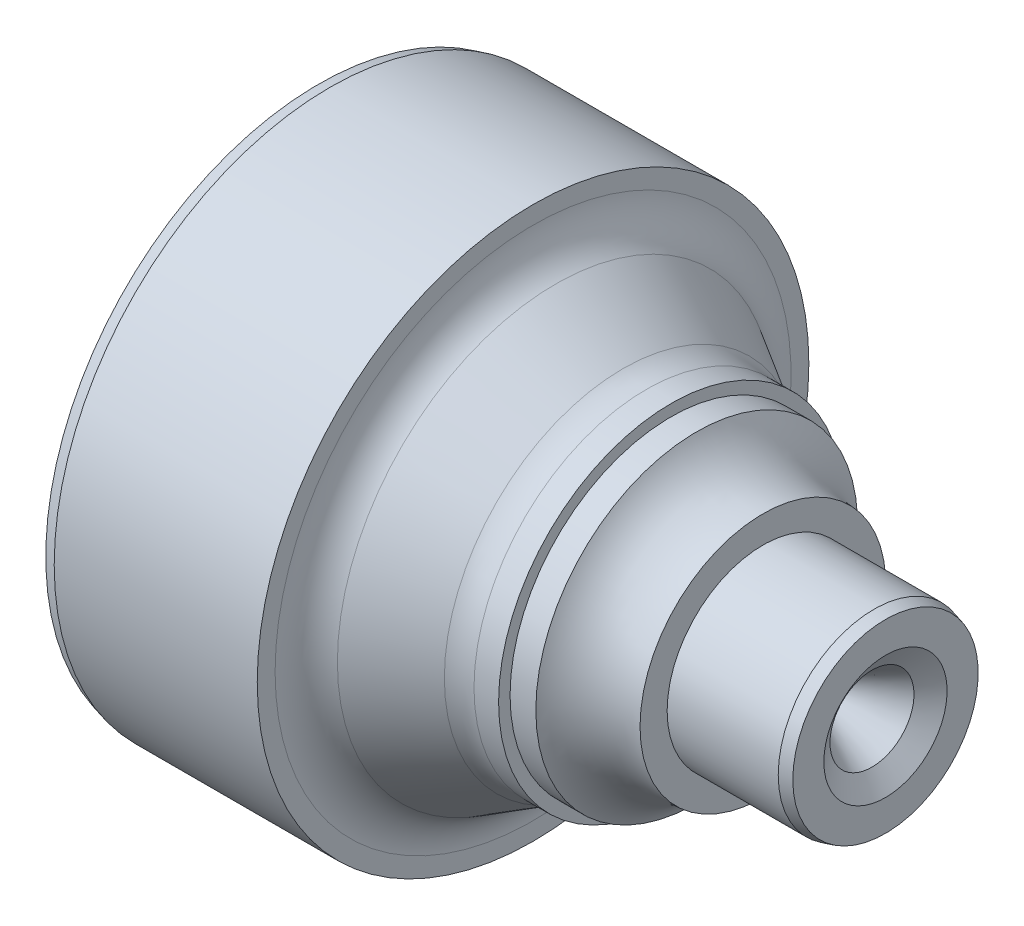
ISO-10303-21;
HEADER;
FILE_DESCRIPTION(('STEP AP214'),'2;1');
FILE_NAME('part.step','',(''),(''),'','','');
FILE_SCHEMA(('AUTOMOTIVE_DESIGN { 1 0 10303 214 1 1 1 1 }'));
ENDSEC;
DATA;
#1=APPLICATION_CONTEXT('core data for automotive mechanical design processes');
#2=APPLICATION_PROTOCOL_DEFINITION('international standard','automotive_design',2000,#1);
#3=PRODUCT_CONTEXT('',#1,'mechanical');
#4=PRODUCT('Part','Part','',(#3));
#5=PRODUCT_RELATED_PRODUCT_CATEGORY('part','',(#4));
#6=PRODUCT_DEFINITION_FORMATION('','',#4);
#7=PRODUCT_DEFINITION_CONTEXT('part definition',#1,'design');
#8=PRODUCT_DEFINITION('design','',#6,#7);
#9=PRODUCT_DEFINITION_SHAPE('','',#8);
#10=(LENGTH_UNIT() NAMED_UNIT(*) SI_UNIT(.MILLI.,.METRE.));
#11=(NAMED_UNIT(*) PLANE_ANGLE_UNIT() SI_UNIT($,.RADIAN.));
#12=(NAMED_UNIT(*) SI_UNIT($,.STERADIAN.) SOLID_ANGLE_UNIT());
#13=UNCERTAINTY_MEASURE_WITH_UNIT(LENGTH_MEASURE(1.E-05),#10,'distance_accuracy_value','');
#14=(GEOMETRIC_REPRESENTATION_CONTEXT(3) GLOBAL_UNCERTAINTY_ASSIGNED_CONTEXT((#13)) GLOBAL_UNIT_ASSIGNED_CONTEXT((#10,
#11,#12)) REPRESENTATION_CONTEXT('',''));
#15=CARTESIAN_POINT('',(0.,0.,0.));
#16=DIRECTION('',(0.,0.,1.));
#17=DIRECTION('',(1.,0.,0.));
#18=AXIS2_PLACEMENT_3D('',#15,#16,#17);
#19=CARTESIAN_POINT('',(13.8510470435798,0.,0.));
#20=DIRECTION('',(-1.,0.,0.));
#21=DIRECTION('',(0.,0.,1.));
#22=AXIS2_PLACEMENT_3D('',#19,#20,#21);
#23=TOROIDAL_SURFACE('',#22,22.,6.);
#24=CARTESIAN_POINT('',(17.8950642205856,0.,0.));
#25=DIRECTION('',(-1.,0.,0.));
#26=DIRECTION('',(0.,0.,1.));
#27=AXIS2_PLACEMENT_3D('',#24,#25,#26);
#28=CIRCLE('',#27,26.4323723977213);
#29=CARTESIAN_POINT('',(17.8950642205856,0.,26.4323723977213));
#30=VERTEX_POINT('',#29);
#31=EDGE_CURVE('E70',#30,#30,#28,.T.);
#32=ORIENTED_EDGE('',*,*,#31,.F.);
#33=EDGE_LOOP('',(#32));
#34=FACE_BOUND('',#33,.T.);
#35=CARTESIAN_POINT('',(13.8510470435798,0.,0.));
#36=DIRECTION('',(-1.,0.,0.));
#37=DIRECTION('',(0.,0.,1.));
#38=AXIS2_PLACEMENT_3D('',#35,#36,#37);
#39=CIRCLE('',#38,28.);
#40=CARTESIAN_POINT('',(13.8510470435798,0.,28.));
#41=VERTEX_POINT('',#40);
#42=EDGE_CURVE('E73',#41,#41,#39,.T.);
#43=ORIENTED_EDGE('',*,*,#42,.T.);
#44=EDGE_LOOP('',(#43));
#45=FACE_BOUND('',#44,.T.);
#46=ADVANCED_FACE('F33',(#34,#45),#23,.F.);
#47=CARTESIAN_POINT('',(17.8950642205856,0.,0.));
#48=DIRECTION('',(-1.,0.,0.));
#49=DIRECTION('',(0.,0.,1.));
#50=AXIS2_PLACEMENT_3D('',#47,#48,#49);
#51=CONICAL_SURFACE('',#50,26.4323723977213,0.739614068084325);
#52=CARTESIAN_POINT('',(21.5888599995515,0.,0.));
#53=DIRECTION('',(-1.,0.,0.));
#54=DIRECTION('',(0.,0.,1.));
#55=AXIS2_PLACEMENT_3D('',#52,#53,#54);
#56=CIRCLE('',#55,23.0622192972803);
#57=CARTESIAN_POINT('',(21.5888599995515,0.,23.0622192972803));
#58=VERTEX_POINT('',#57);
#59=EDGE_CURVE('E125',#58,#58,#56,.T.);
#60=ORIENTED_EDGE('',*,*,#59,.F.);
#61=EDGE_LOOP('',(#60));
#62=FACE_BOUND('',#61,.T.);
#63=ORIENTED_EDGE('',*,*,#31,.T.);
#64=EDGE_LOOP('',(#63));
#65=FACE_BOUND('',#64,.T.);
#66=ADVANCED_FACE('F60',(#62,#65),#51,.F.);
#67=CARTESIAN_POINT('',(25.6328771765573,0.,0.));
#68=DIRECTION('',(-1.,0.,0.));
#69=DIRECTION('',(0.,0.,1.));
#70=AXIS2_PLACEMENT_3D('',#67,#68,#69);
#71=TOROIDAL_SURFACE('',#70,27.4945916950017,6.);
#72=CARTESIAN_POINT('',(23.2527167822253,0.,0.));
#73=DIRECTION('',(-1.,0.,0.));
#74=DIRECTION('',(0.,0.,1.));
#75=AXIS2_PLACEMENT_3D('',#72,#73,#74);
#76=CIRCLE('',#75,21.9868846859775);
#77=CARTESIAN_POINT('',(23.2527167822253,0.,21.9868846859775));
#78=VERTEX_POINT('',#77);
#79=EDGE_CURVE('E122',#78,#78,#76,.T.);
#80=ORIENTED_EDGE('',*,*,#79,.F.);
#81=EDGE_LOOP('',(#80));
#82=FACE_BOUND('',#81,.T.);
#83=ORIENTED_EDGE('',*,*,#59,.T.);
#84=EDGE_LOOP('',(#83));
#85=FACE_BOUND('',#84,.T.);
#86=ADVANCED_FACE('F65',(#82,#85),#71,.T.);
#87=CARTESIAN_POINT('',(23.2527167822253,0.,0.));
#88=DIRECTION('',(-1.,0.,0.));
#89=DIRECTION('',(0.,0.,1.));
#90=AXIS2_PLACEMENT_3D('',#87,#88,#89);
#91=CONICAL_SURFACE('',#90,21.9868846859775,0.407911876763046);
#92=CARTESIAN_POINT('',(46.5166278808393,0.,0.));
#93=DIRECTION('',(-1.,0.,0.));
#94=DIRECTION('',(0.,0.,1.));
#95=AXIS2_PLACEMENT_3D('',#92,#93,#94);
#96=CIRCLE('',#95,11.9333651862189);
#97=CARTESIAN_POINT('',(46.5166278808393,0.,11.9333651862189));
#98=VERTEX_POINT('',#97);
#99=EDGE_CURVE('E119',#98,#98,#96,.T.);
#100=ORIENTED_EDGE('',*,*,#99,.F.);
#101=EDGE_LOOP('',(#100));
#102=FACE_BOUND('',#101,.T.);
#103=ORIENTED_EDGE('',*,*,#79,.T.);
#104=EDGE_LOOP('',(#103));
#105=FACE_BOUND('',#104,.T.);
#106=ADVANCED_FACE('F55',(#102,#105),#91,.F.);
#107=CARTESIAN_POINT('',(41.3596136931201,0.,0.));
#108=DIRECTION('',(-1.,0.,0.));
#109=DIRECTION('',(0.,1.,0.));
#110=AXIS2_PLACEMENT_3D('',#107,#108,#109);
#111=SPHERICAL_SURFACE('',#110,13.);
#112=ORIENTED_EDGE('',*,*,#99,.T.);
#113=EDGE_LOOP('',(#112));
#114=FACE_BOUND('',#113,.T.);
#115=ADVANCED_FACE('F45',(#114),#111,.F.);
#116=CARTESIAN_POINT('',(60.0496736379267,0.,0.));
#117=DIRECTION('',(1.,0.,0.));
#118=DIRECTION('',(0.,0.,-1.));
#119=AXIS2_PLACEMENT_3D('',#116,#117,#118);
#120=CONICAL_SURFACE('',#119,0.,1.04719755119659);
#121=CARTESIAN_POINT('',(61.2043741763059,0.,0.));
#122=DIRECTION('',(-1.,0.,0.));
#123=DIRECTION('',(0.,0.,1.));
#124=AXIS2_PLACEMENT_3D('',#121,#122,#123);
#125=CIRCLE('',#124,2.);
#126=CARTESIAN_POINT('',(61.2043741763059,0.,2.));
#127=VERTEX_POINT('',#126);
#128=EDGE_CURVE('E116',#127,#127,#125,.T.);
#129=ORIENTED_EDGE('',*,*,#128,.F.);
#130=EDGE_LOOP('',(#129));
#131=FACE_BOUND('',#130,.T.);
#132=CARTESIAN_POINT('',(60.0496736379267,0.,0.));
#133=VERTEX_POINT('',#132);
#134=VERTEX_LOOP('',#133);
#135=FACE_BOUND('',#134,.T.);
#136=ADVANCED_FACE('F42',(#131,#135),#120,.F.);
#137=CARTESIAN_POINT('',(-56.8795570698467,0.,0.));
#138=DIRECTION('',(-1.,0.,0.));
#139=DIRECTION('',(0.,0.,1.));
#140=AXIS2_PLACEMENT_3D('',#137,#138,#139);
#141=CYLINDRICAL_SURFACE('',#140,2.);
#142=CARTESIAN_POINT('',(66.2043741763059,0.,0.));
#143=DIRECTION('',(-1.,0.,0.));
#144=DIRECTION('',(0.,0.,1.));
#145=AXIS2_PLACEMENT_3D('',#142,#143,#144);
#146=CIRCLE('',#145,2.);
#147=CARTESIAN_POINT('',(66.2043741763059,0.,2.));
#148=VERTEX_POINT('',#147);
#149=EDGE_CURVE('E113',#148,#148,#146,.T.);
#150=ORIENTED_EDGE('',*,*,#149,.F.);
#151=EDGE_LOOP('',(#150));
#152=FACE_BOUND('',#151,.T.);
#153=ORIENTED_EDGE('',*,*,#128,.T.);
#154=EDGE_LOOP('',(#153));
#155=FACE_BOUND('',#154,.T.);
#156=ADVANCED_FACE('F44',(#152,#155),#141,.F.);
#157=CARTESIAN_POINT('',(66.2043741763059,0.,0.));
#158=DIRECTION('',(1.,0.,0.));
#159=DIRECTION('',(0.,0.,-1.));
#160=AXIS2_PLACEMENT_3D('',#157,#158,#159);
#161=CONICAL_SURFACE('',#160,2.,0.523598775598299);
#162=CARTESIAN_POINT('',(72.2372092375728,0.,0.));
#163=DIRECTION('',(-1.,0.,0.));
#164=DIRECTION('',(0.,0.,1.));
#165=AXIS2_PLACEMENT_3D('',#162,#163,#164);
#166=CIRCLE('',#165,5.48305894659906);
#167=CARTESIAN_POINT('',(72.2372092375728,0.,5.48305894659906));
#168=VERTEX_POINT('',#167);
#169=EDGE_CURVE('E110',#168,#168,#166,.T.);
#170=ORIENTED_EDGE('',*,*,#169,.F.);
#171=EDGE_LOOP('',(#170));
#172=FACE_BOUND('',#171,.T.);
#173=ORIENTED_EDGE('',*,*,#149,.T.);
#174=EDGE_LOOP('',(#173));
#175=FACE_BOUND('',#174,.T.);
#176=ADVANCED_FACE('F52',(#172,#175),#161,.F.);
#177=CARTESIAN_POINT('',(72.2372092375728,0.,0.));
#178=DIRECTION('',(1.,0.,0.));
#179=DIRECTION('',(0.,0.,-1.));
#180=AXIS2_PLACEMENT_3D('',#177,#178,#179);
#181=CONICAL_SURFACE('',#180,5.48305894659906,0.96780778620653);
#182=CARTESIAN_POINT('',(74.,0.,0.));
#183=DIRECTION('',(-1.,0.,0.));
#184=DIRECTION('',(0.,0.,1.));
#185=AXIS2_PLACEMENT_3D('',#182,#183,#184);
#186=CIRCLE('',#185,8.04327096825696);
#187=CARTESIAN_POINT('',(74.,0.,8.04327096825696));
#188=VERTEX_POINT('',#187);
#189=EDGE_CURVE('E107',#188,#188,#186,.T.);
#190=ORIENTED_EDGE('',*,*,#189,.F.);
#191=EDGE_LOOP('',(#190));
#192=FACE_BOUND('',#191,.T.);
#193=ORIENTED_EDGE('',*,*,#169,.T.);
#194=EDGE_LOOP('',(#193));
#195=FACE_BOUND('',#194,.T.);
#196=ADVANCED_FACE('F214',(#192,#195),#181,.F.);
#197=CARTESIAN_POINT('',(74.,8.04327096825696,0.));
#198=DIRECTION('',(-1.,0.,0.));
#199=DIRECTION('',(0.,0.,1.));
#200=AXIS2_PLACEMENT_3D('',#197,#198,#199);
#201=PLANE('',#200);
#202=CARTESIAN_POINT('',(74.,0.,0.));
#203=DIRECTION('',(-1.,0.,0.));
#204=DIRECTION('',(0.,0.,1.));
#205=AXIS2_PLACEMENT_3D('',#202,#203,#204);
#206=CIRCLE('',#205,12.0980762113533);
#207=CARTESIAN_POINT('',(74.,0.,12.0980762113533));
#208=VERTEX_POINT('',#207);
#209=EDGE_CURVE('E138',#208,#208,#206,.F.);
#210=ORIENTED_EDGE('',*,*,#209,.T.);
#211=EDGE_LOOP('',(#210));
#212=FACE_BOUND('',#211,.T.);
#213=ORIENTED_EDGE('',*,*,#189,.T.);
#214=EDGE_LOOP('',(#213));
#215=FACE_BOUND('',#214,.T.);
#216=ADVANCED_FACE('F210',(#212,#215),#201,.F.);
#217=CARTESIAN_POINT('',(-56.8795570698467,0.,0.));
#218=DIRECTION('',(-1.,0.,0.));
#219=DIRECTION('',(0.,0.,1.));
#220=AXIS2_PLACEMENT_3D('',#217,#218,#219);
#221=CYLINDRICAL_SURFACE('',#220,12.5);
#222=CARTESIAN_POINT('',(72.5,0.,0.));
#223=DIRECTION('',(-1.,0.,0.));
#224=DIRECTION('',(0.,0.,1.));
#225=AXIS2_PLACEMENT_3D('',#222,#223,#224);
#226=CIRCLE('',#225,12.5);
#227=CARTESIAN_POINT('',(72.5,0.,12.5));
#228=VERTEX_POINT('',#227);
#229=EDGE_CURVE('E135',#228,#228,#226,.T.);
#230=ORIENTED_EDGE('',*,*,#229,.T.);
#231=EDGE_LOOP('',(#230));
#232=FACE_BOUND('',#231,.T.);
#233=CARTESIAN_POINT('',(58.,0.,0.));
#234=DIRECTION('',(-1.,0.,0.));
#235=DIRECTION('',(0.,0.,1.));
#236=AXIS2_PLACEMENT_3D('',#233,#234,#235);
#237=CIRCLE('',#236,12.5);
#238=CARTESIAN_POINT('',(58.,0.,12.5));
#239=VERTEX_POINT('',#238);
#240=EDGE_CURVE('E104',#239,#239,#237,.T.);
#241=ORIENTED_EDGE('',*,*,#240,.F.);
#242=EDGE_LOOP('',(#241));
#243=FACE_BOUND('',#242,.T.);
#244=ADVANCED_FACE('F206',(#232,#243),#221,.T.);
#245=CARTESIAN_POINT('',(58.,12.5,0.));
#246=DIRECTION('',(-1.,0.,0.));
#247=DIRECTION('',(0.,0.,1.));
#248=AXIS2_PLACEMENT_3D('',#245,#246,#247);
#249=PLANE('',#248);
#250=CARTESIAN_POINT('',(58.,0.,0.));
#251=DIRECTION('',(-1.,0.,0.));
#252=DIRECTION('',(0.,0.,1.));
#253=AXIS2_PLACEMENT_3D('',#250,#251,#252);
#254=CIRCLE('',#253,16.037379401999);
#255=CARTESIAN_POINT('',(58.,0.,16.037379401999));
#256=VERTEX_POINT('',#255);
#257=EDGE_CURVE('E101',#256,#256,#254,.T.);
#258=ORIENTED_EDGE('',*,*,#257,.F.);
#259=EDGE_LOOP('',(#258));
#260=FACE_BOUND('',#259,.T.);
#261=ORIENTED_EDGE('',*,*,#240,.T.);
#262=EDGE_LOOP('',(#261));
#263=FACE_BOUND('',#262,.T.);
#264=ADVANCED_FACE('F202',(#260,#263),#249,.F.);
#265=CARTESIAN_POINT('',(58.,0.,0.));
#266=DIRECTION('',(-1.,0.,0.));
#267=DIRECTION('',(0.,0.,1.));
#268=AXIS2_PLACEMENT_3D('',#265,#266,#267);
#269=TOROIDAL_SURFACE('',#268,26.037379401999,10.);
#270=CARTESIAN_POINT('',(49.3614347973569,0.,0.));
#271=DIRECTION('',(-1.,0.,0.));
#272=DIRECTION('',(0.,0.,1.));
#273=AXIS2_PLACEMENT_3D('',#270,#271,#272);
#274=CIRCLE('',#273,21.);
#275=CARTESIAN_POINT('',(49.3614347973569,0.,21.));
#276=VERTEX_POINT('',#275);
#277=EDGE_CURVE('E98',#276,#276,#274,.T.);
#278=ORIENTED_EDGE('',*,*,#277,.F.);
#279=EDGE_LOOP('',(#278));
#280=FACE_BOUND('',#279,.T.);
#281=ORIENTED_EDGE('',*,*,#257,.T.);
#282=EDGE_LOOP('',(#281));
#283=FACE_BOUND('',#282,.T.);
#284=ADVANCED_FACE('F198',(#280,#283),#269,.F.);
#285=CARTESIAN_POINT('',(-56.8795570698467,0.,0.));
#286=DIRECTION('',(-1.,0.,0.));
#287=DIRECTION('',(0.,0.,1.));
#288=AXIS2_PLACEMENT_3D('',#285,#286,#287);
#289=CYLINDRICAL_SURFACE('',#288,21.);
#290=CARTESIAN_POINT('',(46.,0.,0.));
#291=DIRECTION('',(-1.,0.,0.));
#292=DIRECTION('',(0.,0.,1.));
#293=AXIS2_PLACEMENT_3D('',#290,#291,#292);
#294=CIRCLE('',#293,21.);
#295=CARTESIAN_POINT('',(46.,0.,21.));
#296=VERTEX_POINT('',#295);
#297=EDGE_CURVE('E95',#296,#296,#294,.T.);
#298=ORIENTED_EDGE('',*,*,#297,.F.);
#299=EDGE_LOOP('',(#298));
#300=FACE_BOUND('',#299,.T.);
#301=ORIENTED_EDGE('',*,*,#277,.T.);
#302=EDGE_LOOP('',(#301));
#303=FACE_BOUND('',#302,.T.);
#304=ADVANCED_FACE('F194',(#300,#303),#289,.T.);
#305=CARTESIAN_POINT('',(46.,21.,0.));
#306=DIRECTION('',(-1.,0.,0.));
#307=DIRECTION('',(0.,0.,1.));
#308=AXIS2_PLACEMENT_3D('',#305,#306,#307);
#309=PLANE('',#308);
#310=CARTESIAN_POINT('',(46.,0.,0.));
#311=DIRECTION('',(-1.,0.,0.));
#312=DIRECTION('',(0.,0.,1.));
#313=AXIS2_PLACEMENT_3D('',#310,#311,#312);
#314=CIRCLE('',#313,22.5);
#315=CARTESIAN_POINT('',(46.,0.,22.5));
#316=VERTEX_POINT('',#315);
#317=EDGE_CURVE('E92',#316,#316,#314,.T.);
#318=ORIENTED_EDGE('',*,*,#317,.F.);
#319=EDGE_LOOP('',(#318));
#320=FACE_BOUND('',#319,.T.);
#321=ORIENTED_EDGE('',*,*,#297,.T.);
#322=EDGE_LOOP('',(#321));
#323=FACE_BOUND('',#322,.T.);
#324=ADVANCED_FACE('F190',(#320,#323),#309,.F.);
#325=CARTESIAN_POINT('',(-56.8795570698467,0.,0.));
#326=DIRECTION('',(-1.,0.,0.));
#327=DIRECTION('',(0.,0.,1.));
#328=AXIS2_PLACEMENT_3D('',#325,#326,#327);
#329=CYLINDRICAL_SURFACE('',#328,22.5);
#330=CARTESIAN_POINT('',(42.7913007490573,0.,0.));
#331=DIRECTION('',(-1.,0.,0.));
#332=DIRECTION('',(0.,0.,1.));
#333=AXIS2_PLACEMENT_3D('',#330,#331,#332);
#334=CIRCLE('',#333,22.5);
#335=CARTESIAN_POINT('',(42.7913007490573,0.,22.5));
#336=VERTEX_POINT('',#335);
#337=EDGE_CURVE('E89',#336,#336,#334,.T.);
#338=ORIENTED_EDGE('',*,*,#337,.F.);
#339=EDGE_LOOP('',(#338));
#340=FACE_BOUND('',#339,.T.);
#341=ORIENTED_EDGE('',*,*,#317,.T.);
#342=EDGE_LOOP('',(#341));
#343=FACE_BOUND('',#342,.T.);
#344=ADVANCED_FACE('F186',(#340,#343),#329,.T.);
#345=CARTESIAN_POINT('',(42.7913007490573,0.,0.));
#346=DIRECTION('',(-1.,0.,0.));
#347=DIRECTION('',(0.,0.,1.));
#348=AXIS2_PLACEMENT_3D('',#345,#346,#347);
#349=TOROIDAL_SURFACE('',#348,28.5,6.);
#350=CARTESIAN_POINT('',(39.7502960655723,0.,0.));
#351=DIRECTION('',(-1.,0.,0.));
#352=DIRECTION('',(0.,0.,1.));
#353=AXIS2_PLACEMENT_3D('',#350,#351,#352);
#354=CIRCLE('',#353,23.3277383559006);
#355=CARTESIAN_POINT('',(39.7502960655723,0.,23.3277383559006));
#356=VERTEX_POINT('',#355);
#357=EDGE_CURVE('E86',#356,#356,#354,.T.);
#358=ORIENTED_EDGE('',*,*,#357,.F.);
#359=EDGE_LOOP('',(#358));
#360=FACE_BOUND('',#359,.T.);
#361=ORIENTED_EDGE('',*,*,#337,.T.);
#362=EDGE_LOOP('',(#361));
#363=FACE_BOUND('',#362,.T.);
#364=ADVANCED_FACE('F182',(#360,#363),#349,.F.);
#365=CARTESIAN_POINT('',(39.7502960655723,0.,0.));
#366=DIRECTION('',(-1.,0.,0.));
#367=DIRECTION('',(0.,0.,1.));
#368=AXIS2_PLACEMENT_3D('',#365,#366,#367);
#369=CONICAL_SURFACE('',#368,23.3277383559006,0.531508272547206);
#370=CARTESIAN_POINT('',(30.958995316515,0.,0.));
#371=DIRECTION('',(-1.,0.,0.));
#372=DIRECTION('',(0.,0.,1.));
#373=AXIS2_PLACEMENT_3D('',#370,#371,#372);
#374=CIRCLE('',#373,28.4965385039571);
#375=CARTESIAN_POINT('',(30.958995316515,0.,28.4965385039571));
#376=VERTEX_POINT('',#375);
#377=EDGE_CURVE('E83',#376,#376,#374,.T.);
#378=ORIENTED_EDGE('',*,*,#377,.F.);
#379=EDGE_LOOP('',(#378));
#380=FACE_BOUND('',#379,.T.);
#381=ORIENTED_EDGE('',*,*,#357,.T.);
#382=EDGE_LOOP('',(#381));
#383=FACE_BOUND('',#382,.T.);
#384=ADVANCED_FACE('F178',(#380,#383),#369,.T.);
#385=CARTESIAN_POINT('',(34.,0.,0.));
#386=DIRECTION('',(-1.,0.,0.));
#387=DIRECTION('',(0.,0.,1.));
#388=AXIS2_PLACEMENT_3D('',#385,#386,#387);
#389=TOROIDAL_SURFACE('',#388,33.6688001480565,6.);
#390=CARTESIAN_POINT('',(28.,0.,0.));
#391=DIRECTION('',(-1.,0.,0.));
#392=DIRECTION('',(0.,0.,1.));
#393=AXIS2_PLACEMENT_3D('',#390,#391,#392);
#394=CIRCLE('',#393,33.6688001480565);
#395=CARTESIAN_POINT('',(28.,0.,33.6688001480565));
#396=VERTEX_POINT('',#395);
#397=EDGE_CURVE('E78',#396,#396,#394,.T.);
#398=ORIENTED_EDGE('',*,*,#397,.F.);
#399=EDGE_LOOP('',(#398));
#400=FACE_BOUND('',#399,.T.);
#401=ORIENTED_EDGE('',*,*,#377,.T.);
#402=EDGE_LOOP('',(#401));
#403=FACE_BOUND('',#402,.T.);
#404=ADVANCED_FACE('F174',(#400,#403),#389,.F.);
#405=CARTESIAN_POINT('',(28.,33.6688001480565,0.));
#406=DIRECTION('',(-1.,0.,0.));
#407=DIRECTION('',(0.,0.,1.));
#408=AXIS2_PLACEMENT_3D('',#405,#406,#407);
#409=PLANE('',#408);
#410=CARTESIAN_POINT('',(28.,0.,0.));
#411=DIRECTION('',(-1.,0.,0.));
#412=DIRECTION('',(0.,0.,1.));
#413=AXIS2_PLACEMENT_3D('',#410,#411,#412);
#414=CIRCLE('',#413,36.);
#415=CARTESIAN_POINT('',(28.,0.,36.));
#416=VERTEX_POINT('',#415);
#417=EDGE_CURVE('E75',#416,#416,#414,.T.);
#418=ORIENTED_EDGE('',*,*,#417,.F.);
#419=EDGE_LOOP('',(#418));
#420=FACE_BOUND('',#419,.T.);
#421=ORIENTED_EDGE('',*,*,#397,.T.);
#422=EDGE_LOOP('',(#421));
#423=FACE_BOUND('',#422,.T.);
#424=ADVANCED_FACE('F170',(#420,#423),#409,.F.);
#425=CARTESIAN_POINT('',(-56.8795570698467,0.,0.));
#426=DIRECTION('',(-1.,0.,0.));
#427=DIRECTION('',(0.,0.,1.));
#428=AXIS2_PLACEMENT_3D('',#425,#426,#427);
#429=CYLINDRICAL_SURFACE('',#428,36.);
#430=CARTESIAN_POINT('',(1.5,0.,0.));
#431=DIRECTION('',(1.,0.,0.));
#432=DIRECTION('',(0.,0.,-1.));
#433=AXIS2_PLACEMENT_3D('',#430,#431,#432);
#434=CIRCLE('',#433,36.);
#435=CARTESIAN_POINT('',(1.5,0.,-36.));
#436=VERTEX_POINT('',#435);
#437=EDGE_CURVE('E132',#436,#436,#434,.T.);
#438=ORIENTED_EDGE('',*,*,#437,.T.);
#439=EDGE_LOOP('',(#438));
#440=FACE_BOUND('',#439,.T.);
#441=ORIENTED_EDGE('',*,*,#417,.T.);
#442=EDGE_LOOP('',(#441));
#443=FACE_BOUND('',#442,.T.);
#444=ADVANCED_FACE('F166',(#440,#443),#429,.T.);
#445=CARTESIAN_POINT('',(0.,36.,0.));
#446=DIRECTION('',(1.,0.,0.));
#447=DIRECTION('',(0.,0.,-1.));
#448=AXIS2_PLACEMENT_3D('',#445,#446,#447);
#449=PLANE('',#448);
#450=CARTESIAN_POINT('',(0.,0.,0.));
#451=DIRECTION('',(1.,0.,0.));
#452=DIRECTION('',(0.,0.,-1.));
#453=AXIS2_PLACEMENT_3D('',#450,#451,#452);
#454=CIRCLE('',#453,29.5);
#455=CARTESIAN_POINT('',(0.,0.,-29.5));
#456=VERTEX_POINT('',#455);
#457=EDGE_CURVE('E11',#456,#456,#454,.T.);
#458=ORIENTED_EDGE('',*,*,#457,.T.);
#459=EDGE_LOOP('',(#458));
#460=FACE_BOUND('',#459,.T.);
#461=CARTESIAN_POINT('',(0.,0.,0.));
#462=DIRECTION('',(1.,0.,0.));
#463=DIRECTION('',(0.,0.,-1.));
#464=AXIS2_PLACEMENT_3D('',#461,#462,#463);
#465=CIRCLE('',#464,35.5980762113533);
#466=CARTESIAN_POINT('',(0.,0.,-35.5980762113533));
#467=VERTEX_POINT('',#466);
#468=EDGE_CURVE('E129',#467,#467,#465,.F.);
#469=ORIENTED_EDGE('',*,*,#468,.T.);
#470=EDGE_LOOP('',(#469));
#471=FACE_BOUND('',#470,.T.);
#472=ADVANCED_FACE('F163',(#460,#471),#449,.F.);
#473=CARTESIAN_POINT('',(-56.8795570698467,0.,0.));
#474=DIRECTION('',(-1.,0.,0.));
#475=DIRECTION('',(0.,0.,1.));
#476=AXIS2_PLACEMENT_3D('',#473,#474,#475);
#477=CYLINDRICAL_SURFACE('',#476,28.);
#478=CARTESIAN_POINT('',(1.50000000000001,0.,0.));
#479=DIRECTION('',(1.,0.,0.));
#480=DIRECTION('',(0.,0.,-1.));
#481=AXIS2_PLACEMENT_3D('',#478,#479,#480);
#482=CIRCLE('',#481,28.);
#483=CARTESIAN_POINT('',(1.50000000000001,0.,-28.));
#484=VERTEX_POINT('',#483);
#485=EDGE_CURVE('E39',#484,#484,#482,.F.);
#486=ORIENTED_EDGE('',*,*,#485,.T.);
#487=EDGE_LOOP('',(#486));
#488=FACE_BOUND('',#487,.T.);
#489=ORIENTED_EDGE('',*,*,#42,.F.);
#490=EDGE_LOOP('',(#489));
#491=FACE_BOUND('',#490,.T.);
#492=ADVANCED_FACE('F143',(#488,#491),#477,.F.);
#493=CARTESIAN_POINT('',(0.,0.,0.));
#494=DIRECTION('',(1.,0.,0.));
#495=DIRECTION('',(0.,0.,-1.));
#496=AXIS2_PLACEMENT_3D('',#493,#494,#495);
#497=CONICAL_SURFACE('',#496,35.5980762113533,0.261799387799156);
#498=ORIENTED_EDGE('',*,*,#437,.F.);
#499=EDGE_LOOP('',(#498));
#500=FACE_BOUND('',#499,.T.);
#501=ORIENTED_EDGE('',*,*,#468,.F.);
#502=EDGE_LOOP('',(#501));
#503=FACE_BOUND('',#502,.T.);
#504=ADVANCED_FACE('F153',(#500,#503),#497,.T.);
#505=CARTESIAN_POINT('',(72.5,0.,0.));
#506=DIRECTION('',(-1.,0.,0.));
#507=DIRECTION('',(0.,0.,1.));
#508=AXIS2_PLACEMENT_3D('',#505,#506,#507);
#509=CONICAL_SURFACE('',#508,12.5,0.261799387799157);
#510=ORIENTED_EDGE('',*,*,#209,.F.);
#511=EDGE_LOOP('',(#510));
#512=FACE_BOUND('',#511,.T.);
#513=ORIENTED_EDGE('',*,*,#229,.F.);
#514=EDGE_LOOP('',(#513));
#515=FACE_BOUND('',#514,.T.);
#516=ADVANCED_FACE('F147',(#512,#515),#509,.T.);
#517=CARTESIAN_POINT('',(1.50000000000001,0.,0.));
#518=DIRECTION('',(-1.,0.,0.));
#519=DIRECTION('',(0.,0.,1.));
#520=AXIS2_PLACEMENT_3D('',#517,#518,#519);
#521=CONICAL_SURFACE('',#520,28.,0.785398163397454);
#522=ORIENTED_EDGE('',*,*,#457,.F.);
#523=EDGE_LOOP('',(#522));
#524=FACE_BOUND('',#523,.T.);
#525=ORIENTED_EDGE('',*,*,#485,.F.);
#526=EDGE_LOOP('',(#525));
#527=FACE_BOUND('',#526,.T.);
#528=ADVANCED_FACE('F145',(#524,#527),#521,.F.);
#529=CLOSED_SHELL('',(#46,#66,#86,#106,#115,#136,#156,#176,#196,#216,#244,#264,#284,#304,#324,
#344,#364,#384,#404,#424,#444,#472,#492,#504,#516,#528));
#530=MANIFOLD_SOLID_BREP('B2',#529);
#531=ADVANCED_BREP_SHAPE_REPRESENTATION('',(#18,#530),#14);
#532=SHAPE_DEFINITION_REPRESENTATION(#9,#531);
ENDSEC;
END-ISO-10303-21;
